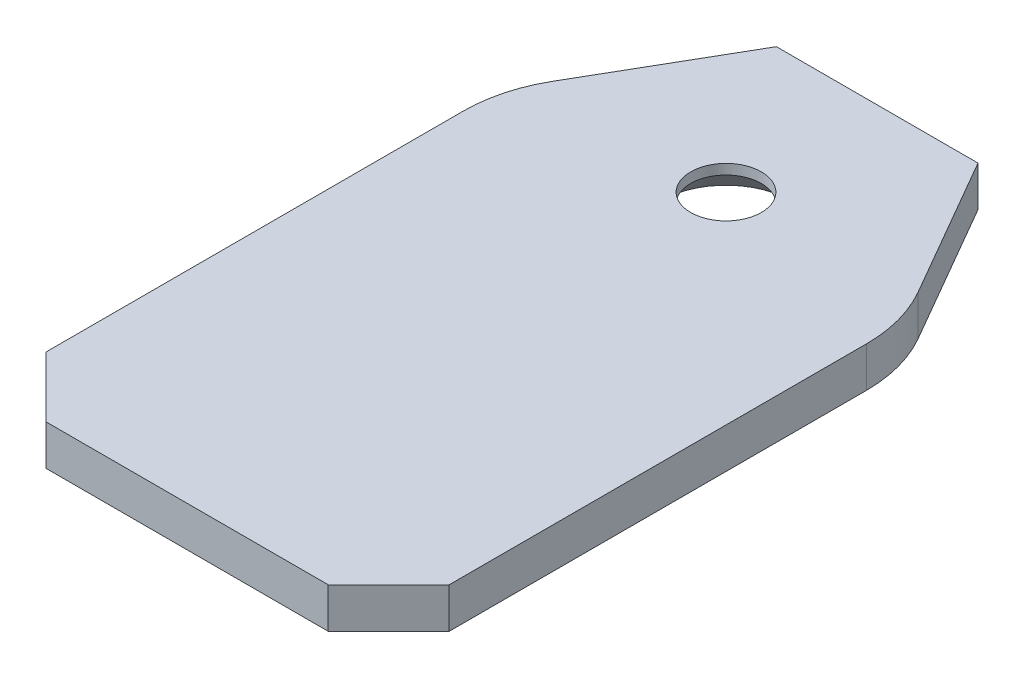
ISO-10303-21;
HEADER;
FILE_DESCRIPTION(('STEP AP214'),'2;1');
FILE_NAME('part.step','',(''),(''),'','','');
FILE_SCHEMA(('AUTOMOTIVE_DESIGN { 1 0 10303 214 1 1 1 1 }'));
ENDSEC;
DATA;
#1=APPLICATION_CONTEXT('core data for automotive mechanical design processes');
#2=APPLICATION_PROTOCOL_DEFINITION('international standard','automotive_design',2000,#1);
#3=PRODUCT_CONTEXT('',#1,'mechanical');
#4=PRODUCT('Part','Part','',(#3));
#5=PRODUCT_RELATED_PRODUCT_CATEGORY('part','',(#4));
#6=PRODUCT_DEFINITION_FORMATION('','',#4);
#7=PRODUCT_DEFINITION_CONTEXT('part definition',#1,'design');
#8=PRODUCT_DEFINITION('design','',#6,#7);
#9=PRODUCT_DEFINITION_SHAPE('','',#8);
#10=(LENGTH_UNIT() NAMED_UNIT(*) SI_UNIT(.MILLI.,.METRE.));
#11=(NAMED_UNIT(*) PLANE_ANGLE_UNIT() SI_UNIT($,.RADIAN.));
#12=(NAMED_UNIT(*) SI_UNIT($,.STERADIAN.) SOLID_ANGLE_UNIT());
#13=UNCERTAINTY_MEASURE_WITH_UNIT(LENGTH_MEASURE(1.E-05),#10,'distance_accuracy_value','');
#14=(GEOMETRIC_REPRESENTATION_CONTEXT(3) GLOBAL_UNCERTAINTY_ASSIGNED_CONTEXT((#13)) GLOBAL_UNIT_ASSIGNED_CONTEXT((#10,
#11,#12)) REPRESENTATION_CONTEXT('',''));
#15=CARTESIAN_POINT('',(0.,0.,0.));
#16=DIRECTION('',(0.,0.,1.));
#17=DIRECTION('',(1.,0.,0.));
#18=AXIS2_PLACEMENT_3D('',#15,#16,#17);
#19=CARTESIAN_POINT('',(-14.1834789470327,-2.,7.17721720077273));
#20=DIRECTION('',(0.,1.,0.));
#21=DIRECTION('',(0.,0.,1.));
#22=AXIS2_PLACEMENT_3D('',#19,#20,#21);
#23=CYLINDRICAL_SURFACE('',#22,7.00000000000001);
#24=CARTESIAN_POINT('',(-14.1834789470327,0.,7.17721720077273));
#25=DIRECTION('',(0.,1.,0.));
#26=DIRECTION('',(0.,0.,1.));
#27=AXIS2_PLACEMENT_3D('',#24,#25,#26);
#28=CIRCLE('',#27,7.00000000000001);
#29=CARTESIAN_POINT('',(-20.2456567735238,0.,3.67721720077272));
#30=VERTEX_POINT('',#29);
#31=CARTESIAN_POINT('',(-21.1834789470327,0.,7.17721720077273));
#32=VERTEX_POINT('',#31);
#33=EDGE_CURVE('E169',#30,#32,#28,.T.);
#34=ORIENTED_EDGE('',*,*,#33,.F.);
#35=DIRECTION('',(0.,1.,0.));
#36=VECTOR('',#35,1.);
#37=CARTESIAN_POINT('',(-20.2456567735238,-2.,3.67721720077272));
#38=LINE('',#37,#36);
#39=CARTESIAN_POINT('',(-20.2456567735238,-2.,3.67721720077272));
#40=VERTEX_POINT('',#39);
#41=EDGE_CURVE('E177',#40,#30,#38,.T.);
#42=ORIENTED_EDGE('',*,*,#41,.F.);
#43=CARTESIAN_POINT('',(-14.1834789470327,-2.,7.17721720077273));
#44=DIRECTION('',(0.,1.,0.));
#45=DIRECTION('',(0.,0.,1.));
#46=AXIS2_PLACEMENT_3D('',#43,#44,#45);
#47=CIRCLE('',#46,7.00000000000001);
#48=CARTESIAN_POINT('',(-21.1834789470327,-2.,7.17721720077273));
#49=VERTEX_POINT('',#48);
#50=EDGE_CURVE('E131',#40,#49,#47,.T.);
#51=ORIENTED_EDGE('',*,*,#50,.T.);
#52=DIRECTION('',(0.,1.,0.));
#53=VECTOR('',#52,1.);
#54=CARTESIAN_POINT('',(-21.1834789470327,-2.,7.17721720077273));
#55=LINE('',#54,#53);
#56=EDGE_CURVE('E173',#49,#32,#55,.T.);
#57=ORIENTED_EDGE('',*,*,#56,.T.);
#58=EDGE_LOOP('',(#34,#42,#51,#57));
#59=FACE_BOUND('',#58,.T.);
#60=ADVANCED_FACE('F36',(#59),#23,.T.);
#61=CARTESIAN_POINT('',(-16.1834789470327,-2.,-3.35868118408953));
#62=DIRECTION('',(-0.866025403784438,0.,-0.500000000000001));
#63=DIRECTION('',(-0.500000000000001,0.,0.866025403784438));
#64=AXIS2_PLACEMENT_3D('',#61,#62,#63);
#65=PLANE('',#64);
#66=DIRECTION('',(-0.500000000000001,0.,0.866025403784438));
#67=VECTOR('',#66,1.);
#68=CARTESIAN_POINT('',(-16.1834789470327,0.,-3.35868118408953));
#69=LINE('',#68,#67);
#70=CARTESIAN_POINT('',(-16.1834789470327,0.,-3.35868118408953));
#71=VERTEX_POINT('',#70);
#72=EDGE_CURVE('E166',#71,#30,#69,.T.);
#73=ORIENTED_EDGE('',*,*,#72,.F.);
#74=DIRECTION('',(0.,1.,0.));
#75=VECTOR('',#74,1.);
#76=CARTESIAN_POINT('',(-16.1834789470327,-2.,-3.35868118408953));
#77=LINE('',#76,#75);
#78=CARTESIAN_POINT('',(-16.1834789470327,-2.,-3.35868118408953));
#79=VERTEX_POINT('',#78);
#80=EDGE_CURVE('E179',#79,#71,#77,.T.);
#81=ORIENTED_EDGE('',*,*,#80,.F.);
#82=DIRECTION('',(-0.500000000000001,0.,0.866025403784438));
#83=VECTOR('',#82,1.);
#84=CARTESIAN_POINT('',(-16.1834789470327,-2.,-3.35868118408953));
#85=LINE('',#84,#83);
#86=EDGE_CURVE('E145',#79,#40,#85,.T.);
#87=ORIENTED_EDGE('',*,*,#86,.T.);
#88=ORIENTED_EDGE('',*,*,#41,.T.);
#89=EDGE_LOOP('',(#73,#81,#87,#88));
#90=FACE_BOUND('',#89,.T.);
#91=ADVANCED_FACE('F216',(#90),#65,.T.);
#92=CARTESIAN_POINT('',(-6.1834789470327,-2.,-3.35868118408953));
#93=DIRECTION('',(0.,0.,-1.));
#94=DIRECTION('',(-1.,0.,0.));
#95=AXIS2_PLACEMENT_3D('',#92,#93,#94);
#96=PLANE('',#95);
#97=DIRECTION('',(-1.,0.,0.));
#98=VECTOR('',#97,1.);
#99=CARTESIAN_POINT('',(-6.1834789470327,0.,-3.35868118408953));
#100=LINE('',#99,#98);
#101=CARTESIAN_POINT('',(-6.1834789470327,0.,-3.35868118408953));
#102=VERTEX_POINT('',#101);
#103=EDGE_CURVE('E163',#102,#71,#100,.T.);
#104=ORIENTED_EDGE('',*,*,#103,.F.);
#105=DIRECTION('',(0.,1.,0.));
#106=VECTOR('',#105,1.);
#107=CARTESIAN_POINT('',(-6.1834789470327,-2.,-3.35868118408953));
#108=LINE('',#107,#106);
#109=CARTESIAN_POINT('',(-6.1834789470327,-2.,-3.35868118408953));
#110=VERTEX_POINT('',#109);
#111=EDGE_CURVE('E181',#110,#102,#108,.T.);
#112=ORIENTED_EDGE('',*,*,#111,.F.);
#113=DIRECTION('',(-1.,0.,0.));
#114=VECTOR('',#113,1.);
#115=CARTESIAN_POINT('',(-6.1834789470327,-2.,-3.35868118408953));
#116=LINE('',#115,#114);
#117=EDGE_CURVE('E139',#110,#79,#116,.T.);
#118=ORIENTED_EDGE('',*,*,#117,.T.);
#119=ORIENTED_EDGE('',*,*,#80,.T.);
#120=EDGE_LOOP('',(#104,#112,#118,#119));
#121=FACE_BOUND('',#120,.T.);
#122=ADVANCED_FACE('F222',(#121),#96,.T.);
#123=CARTESIAN_POINT('',(-2.12130112054162,-2.,3.67721720077271));
#124=DIRECTION('',(0.866025403784438,0.,-0.500000000000001));
#125=DIRECTION('',(-0.500000000000001,0.,-0.866025403784438));
#126=AXIS2_PLACEMENT_3D('',#123,#124,#125);
#127=PLANE('',#126);
#128=DIRECTION('',(-0.500000000000001,0.,-0.866025403784438));
#129=VECTOR('',#128,1.);
#130=CARTESIAN_POINT('',(-2.12130112054162,0.,3.67721720077271));
#131=LINE('',#130,#129);
#132=CARTESIAN_POINT('',(-2.12130112054162,0.,3.67721720077271));
#133=VERTEX_POINT('',#132);
#134=EDGE_CURVE('E160',#133,#102,#131,.T.);
#135=ORIENTED_EDGE('',*,*,#134,.F.);
#136=DIRECTION('',(0.,1.,0.));
#137=VECTOR('',#136,1.);
#138=CARTESIAN_POINT('',(-2.12130112054162,-2.,3.67721720077271));
#139=LINE('',#138,#137);
#140=CARTESIAN_POINT('',(-2.12130112054162,-2.,3.67721720077271));
#141=VERTEX_POINT('',#140);
#142=EDGE_CURVE('E130',#141,#133,#139,.T.);
#143=ORIENTED_EDGE('',*,*,#142,.F.);
#144=DIRECTION('',(-0.500000000000001,0.,-0.866025403784438));
#145=VECTOR('',#144,1.);
#146=CARTESIAN_POINT('',(-2.12130112054162,-2.,3.67721720077271));
#147=LINE('',#146,#145);
#148=EDGE_CURVE('E137',#141,#110,#147,.T.);
#149=ORIENTED_EDGE('',*,*,#148,.T.);
#150=ORIENTED_EDGE('',*,*,#111,.T.);
#151=EDGE_LOOP('',(#135,#143,#149,#150));
#152=FACE_BOUND('',#151,.T.);
#153=ADVANCED_FACE('F232',(#152),#127,.T.);
#154=CARTESIAN_POINT('',(-8.18347894703268,-2.,7.17721720077272));
#155=DIRECTION('',(0.,1.,0.));
#156=DIRECTION('',(0.,0.,1.));
#157=AXIS2_PLACEMENT_3D('',#154,#155,#156);
#158=CYLINDRICAL_SURFACE('',#157,7.);
#159=CARTESIAN_POINT('',(-8.18347894703268,0.,7.17721720077272));
#160=DIRECTION('',(0.,1.,0.));
#161=DIRECTION('',(0.,0.,1.));
#162=AXIS2_PLACEMENT_3D('',#159,#160,#161);
#163=CIRCLE('',#162,7.);
#164=CARTESIAN_POINT('',(-1.18347894703268,0.,7.17721720077272));
#165=VERTEX_POINT('',#164);
#166=EDGE_CURVE('E129',#165,#133,#163,.T.);
#167=ORIENTED_EDGE('',*,*,#166,.F.);
#168=DIRECTION('',(0.,1.,0.));
#169=VECTOR('',#168,1.);
#170=CARTESIAN_POINT('',(-1.18347894703268,-2.,7.17721720077272));
#171=LINE('',#170,#169);
#172=CARTESIAN_POINT('',(-1.18347894703268,-2.,7.17721720077272));
#173=VERTEX_POINT('',#172);
#174=EDGE_CURVE('E118',#173,#165,#171,.T.);
#175=ORIENTED_EDGE('',*,*,#174,.F.);
#176=CARTESIAN_POINT('',(-8.18347894703268,-2.,7.17721720077272));
#177=DIRECTION('',(0.,1.,0.));
#178=DIRECTION('',(0.,0.,1.));
#179=AXIS2_PLACEMENT_3D('',#176,#177,#178);
#180=CIRCLE('',#179,7.);
#181=EDGE_CURVE('E122',#173,#141,#180,.T.);
#182=ORIENTED_EDGE('',*,*,#181,.T.);
#183=ORIENTED_EDGE('',*,*,#142,.T.);
#184=EDGE_LOOP('',(#167,#175,#182,#183));
#185=FACE_BOUND('',#184,.T.);
#186=ADVANCED_FACE('F127',(#185),#158,.T.);
#187=CARTESIAN_POINT('',(-1.18347894703268,-2.,7.64131881591047));
#188=DIRECTION('',(1.,0.,0.));
#189=DIRECTION('',(0.,0.,-1.));
#190=AXIS2_PLACEMENT_3D('',#187,#188,#189);
#191=PLANE('',#190);
#192=DIRECTION('',(0.,0.,-1.));
#193=VECTOR('',#192,1.);
#194=CARTESIAN_POINT('',(-1.18347894703268,0.,7.64131881591047));
#195=LINE('',#194,#193);
#196=CARTESIAN_POINT('',(-1.18347894703261,0.,27.8736136443397));
#197=VERTEX_POINT('',#196);
#198=EDGE_CURVE('E157',#197,#165,#195,.T.);
#199=ORIENTED_EDGE('',*,*,#198,.F.);
#200=DIRECTION('',(0.,-1.,0.));
#201=VECTOR('',#200,1.);
#202=CARTESIAN_POINT('',(-1.18347894703261,-2.,27.8736136443397));
#203=LINE('',#202,#201);
#204=CARTESIAN_POINT('',(-1.18347894703268,-2.,27.8736136443397));
#205=VERTEX_POINT('',#204);
#206=EDGE_CURVE('E60',#197,#205,#203,.T.);
#207=ORIENTED_EDGE('',*,*,#206,.T.);
#208=DIRECTION('',(0.,0.,-1.));
#209=VECTOR('',#208,1.);
#210=CARTESIAN_POINT('',(-1.18347894703268,-2.,7.64131881591047));
#211=LINE('',#210,#209);
#212=EDGE_CURVE('E115',#205,#173,#211,.T.);
#213=ORIENTED_EDGE('',*,*,#212,.T.);
#214=ORIENTED_EDGE('',*,*,#174,.T.);
#215=EDGE_LOOP('',(#199,#207,#213,#214));
#216=FACE_BOUND('',#215,.T.);
#217=ADVANCED_FACE('F117',(#216),#191,.T.);
#218=CARTESIAN_POINT('',(-1.18347894703268,-2.,30.8736136443398));
#219=DIRECTION('',(0.,0.,1.));
#220=DIRECTION('',(1.,0.,0.));
#221=AXIS2_PLACEMENT_3D('',#218,#219,#220);
#222=PLANE('',#221);
#223=DIRECTION('',(1.,0.,0.));
#224=VECTOR('',#223,1.);
#225=CARTESIAN_POINT('',(-1.18347894703268,-2.,30.8736136443398));
#226=LINE('',#225,#224);
#227=CARTESIAN_POINT('',(-18.1834789470327,-2.,30.8736136443398));
#228=VERTEX_POINT('',#227);
#229=CARTESIAN_POINT('',(-4.18347894703267,-2.,30.8736136443398));
#230=VERTEX_POINT('',#229);
#231=EDGE_CURVE('E123',#228,#230,#226,.T.);
#232=ORIENTED_EDGE('',*,*,#231,.T.);
#233=DIRECTION('',(0.,1.,0.));
#234=VECTOR('',#233,1.);
#235=CARTESIAN_POINT('',(-4.18347894703267,-2.,30.8736136443398));
#236=LINE('',#235,#234);
#237=CARTESIAN_POINT('',(-4.18347894703267,0.,30.8736136443398));
#238=VERTEX_POINT('',#237);
#239=EDGE_CURVE('E187',#230,#238,#236,.T.);
#240=ORIENTED_EDGE('',*,*,#239,.T.);
#241=DIRECTION('',(1.,0.,0.));
#242=VECTOR('',#241,1.);
#243=CARTESIAN_POINT('',(-1.18347894703268,0.,30.8736136443398));
#244=LINE('',#243,#242);
#245=CARTESIAN_POINT('',(-18.1834789470327,0.,30.8736136443398));
#246=VERTEX_POINT('',#245);
#247=EDGE_CURVE('E153',#246,#238,#244,.T.);
#248=ORIENTED_EDGE('',*,*,#247,.F.);
#249=DIRECTION('',(0.,-1.,0.));
#250=VECTOR('',#249,1.);
#251=CARTESIAN_POINT('',(-18.1834789470327,-2.,30.8736136443398));
#252=LINE('',#251,#250);
#253=EDGE_CURVE('E176',#246,#228,#252,.T.);
#254=ORIENTED_EDGE('',*,*,#253,.T.);
#255=EDGE_LOOP('',(#232,#240,#248,#254));
#256=FACE_BOUND('',#255,.T.);
#257=ADVANCED_FACE('F241',(#256),#222,.T.);
#258=CARTESIAN_POINT('',(-21.1834789470327,-2.,7.64131881591047));
#259=DIRECTION('',(-1.,0.,0.));
#260=DIRECTION('',(0.,0.,1.));
#261=AXIS2_PLACEMENT_3D('',#258,#259,#260);
#262=PLANE('',#261);
#263=DIRECTION('',(0.,0.,1.));
#264=VECTOR('',#263,1.);
#265=CARTESIAN_POINT('',(-21.1834789470327,-2.,7.17721720077273));
#266=LINE('',#265,#264);
#267=CARTESIAN_POINT('',(-21.1834789470327,-2.,27.8736136443398));
#268=VERTEX_POINT('',#267);
#269=EDGE_CURVE('E172',#49,#268,#266,.T.);
#270=ORIENTED_EDGE('',*,*,#269,.T.);
#271=DIRECTION('',(0.,1.,0.));
#272=VECTOR('',#271,1.);
#273=CARTESIAN_POINT('',(-21.1834789470327,-2.,27.8736136443398));
#274=LINE('',#273,#272);
#275=CARTESIAN_POINT('',(-21.1834789470327,0.,27.8736136443398));
#276=VERTEX_POINT('',#275);
#277=EDGE_CURVE('E198',#268,#276,#274,.T.);
#278=ORIENTED_EDGE('',*,*,#277,.T.);
#279=DIRECTION('',(0.,0.,1.));
#280=VECTOR('',#279,1.);
#281=CARTESIAN_POINT('',(-21.1834789470327,0.,7.64131881591047));
#282=LINE('',#281,#280);
#283=EDGE_CURVE('E150',#32,#276,#282,.T.);
#284=ORIENTED_EDGE('',*,*,#283,.F.);
#285=ORIENTED_EDGE('',*,*,#56,.F.);
#286=EDGE_LOOP('',(#270,#278,#284,#285));
#287=FACE_BOUND('',#286,.T.);
#288=ADVANCED_FACE('F244',(#287),#262,.T.);
#289=CARTESIAN_POINT('',(-8.18347894703268,-2.,7.17721720077272));
#290=DIRECTION('',(0.,1.,0.));
#291=DIRECTION('',(0.,0.,1.));
#292=AXIS2_PLACEMENT_3D('',#289,#290,#291);
#293=PLANE('',#292);
#294=CARTESIAN_POINT('',(-11.1834789470327,-2.,4.14131881591047));
#295=DIRECTION('',(0.,1.,0.));
#296=DIRECTION('',(0.,0.,1.));
#297=AXIS2_PLACEMENT_3D('',#294,#295,#296);
#298=CIRCLE('',#297,3.25);
#299=CARTESIAN_POINT('',(-11.1834789470327,-2.,0.891318815910468));
#300=VERTEX_POINT('',#299);
#301=EDGE_CURVE('E11',#300,#300,#298,.T.);
#302=ORIENTED_EDGE('',*,*,#301,.T.);
#303=EDGE_LOOP('',(#302));
#304=FACE_BOUND('',#303,.T.);
#305=ORIENTED_EDGE('',*,*,#212,.F.);
#306=DIRECTION('',(0.707106781186543,0.,-0.707106781186552));
#307=VECTOR('',#306,1.);
#308=CARTESIAN_POINT('',(-4.18347894703267,-2.,30.8736136443398));
#309=LINE('',#308,#307);
#310=EDGE_CURVE('E196',#205,#230,#309,.F.);
#311=ORIENTED_EDGE('',*,*,#310,.T.);
#312=ORIENTED_EDGE('',*,*,#231,.F.);
#313=DIRECTION('',(0.707106781186549,0.,0.707106781186546));
#314=VECTOR('',#313,1.);
#315=CARTESIAN_POINT('',(-21.1834789470327,-2.,27.8736136443398));
#316=LINE('',#315,#314);
#317=EDGE_CURVE('E52',#228,#268,#316,.F.);
#318=ORIENTED_EDGE('',*,*,#317,.T.);
#319=ORIENTED_EDGE('',*,*,#269,.F.);
#320=ORIENTED_EDGE('',*,*,#50,.F.);
#321=ORIENTED_EDGE('',*,*,#86,.F.);
#322=ORIENTED_EDGE('',*,*,#117,.F.);
#323=ORIENTED_EDGE('',*,*,#148,.F.);
#324=ORIENTED_EDGE('',*,*,#181,.F.);
#325=EDGE_LOOP('',(#305,#311,#312,#318,#319,#320,#321,#322,#323,#324));
#326=FACE_BOUND('',#325,.T.);
#327=ADVANCED_FACE('F134',(#304,#326),#293,.F.);
#328=CARTESIAN_POINT('',(-8.18347894703268,0.,7.17721720077272));
#329=DIRECTION('',(0.,1.,0.));
#330=DIRECTION('',(0.,0.,1.));
#331=AXIS2_PLACEMENT_3D('',#328,#329,#330);
#332=PLANE('',#331);
#333=CARTESIAN_POINT('',(-11.1834789470327,0.,4.14131881591047));
#334=DIRECTION('',(0.,1.,0.));
#335=DIRECTION('',(0.,0.,1.));
#336=AXIS2_PLACEMENT_3D('',#333,#334,#335);
#337=CIRCLE('',#336,1.75);
#338=CARTESIAN_POINT('',(-11.1834789470327,0.,5.89131881591047));
#339=VERTEX_POINT('',#338);
#340=EDGE_CURVE('E154',#339,#339,#337,.T.);
#341=ORIENTED_EDGE('',*,*,#340,.F.);
#342=EDGE_LOOP('',(#341));
#343=FACE_BOUND('',#342,.T.);
#344=ORIENTED_EDGE('',*,*,#247,.T.);
#345=DIRECTION('',(-0.707106781186543,0.,0.707106781186552));
#346=VECTOR('',#345,1.);
#347=CARTESIAN_POINT('',(5.66471927475087,0.,21.0254154225561));
#348=LINE('',#347,#346);
#349=EDGE_CURVE('E192',#238,#197,#348,.F.);
#350=ORIENTED_EDGE('',*,*,#349,.T.);
#351=ORIENTED_EDGE('',*,*,#198,.T.);
#352=ORIENTED_EDGE('',*,*,#166,.T.);
#353=ORIENTED_EDGE('',*,*,#134,.T.);
#354=ORIENTED_EDGE('',*,*,#103,.T.);
#355=ORIENTED_EDGE('',*,*,#72,.T.);
#356=ORIENTED_EDGE('',*,*,#33,.T.);
#357=ORIENTED_EDGE('',*,*,#283,.T.);
#358=DIRECTION('',(-0.707106781186549,0.,-0.707106781186546));
#359=VECTOR('',#358,1.);
#360=CARTESIAN_POINT('',(-25.0316771688162,0.,24.0254154225563));
#361=LINE('',#360,#359);
#362=EDGE_CURVE('E190',#276,#246,#361,.F.);
#363=ORIENTED_EDGE('',*,*,#362,.T.);
#364=EDGE_LOOP('',(#344,#350,#351,#352,#353,#354,#355,#356,#357,#363));
#365=FACE_BOUND('',#364,.T.);
#366=ADVANCED_FACE('F227',(#343,#365),#332,.T.);
#367=CARTESIAN_POINT('',(-11.1834789470327,8.,4.14131881591047));
#368=DIRECTION('',(0.,-1.,0.));
#369=DIRECTION('',(0.,0.,-1.));
#370=AXIS2_PLACEMENT_3D('',#367,#368,#369);
#371=CYLINDRICAL_SURFACE('',#370,1.75);
#372=CARTESIAN_POINT('',(-11.1834789470327,-0.499999999999997,4.14131881591047));
#373=DIRECTION('',(0.,1.,0.));
#374=DIRECTION('',(0.,0.,1.));
#375=AXIS2_PLACEMENT_3D('',#372,#373,#374);
#376=CIRCLE('',#375,1.75);
#377=CARTESIAN_POINT('',(-11.1834789470327,-0.499999999999997,2.39131881591047));
#378=VERTEX_POINT('',#377);
#379=EDGE_CURVE('E45',#378,#378,#376,.F.);
#380=ORIENTED_EDGE('',*,*,#379,.T.);
#381=EDGE_LOOP('',(#380));
#382=FACE_BOUND('',#381,.T.);
#383=ORIENTED_EDGE('',*,*,#340,.T.);
#384=EDGE_LOOP('',(#383));
#385=FACE_BOUND('',#384,.T.);
#386=ADVANCED_FACE('F203',(#382,#385),#371,.F.);
#387=CARTESIAN_POINT('',(-4.18347894703267,-2.,30.8736136443398));
#388=DIRECTION('',(-0.707106781186552,0.,-0.707106781186543));
#389=DIRECTION('',(0.,1.,0.));
#390=AXIS2_PLACEMENT_3D('',#387,#388,#389);
#391=PLANE('',#390);
#392=ORIENTED_EDGE('',*,*,#310,.F.);
#393=ORIENTED_EDGE('',*,*,#206,.F.);
#394=ORIENTED_EDGE('',*,*,#349,.F.);
#395=ORIENTED_EDGE('',*,*,#239,.F.);
#396=EDGE_LOOP('',(#392,#393,#394,#395));
#397=FACE_BOUND('',#396,.T.);
#398=ADVANCED_FACE('F212',(#397),#391,.F.);
#399=CARTESIAN_POINT('',(-21.1834789470327,-2.,27.8736136443398));
#400=DIRECTION('',(0.707106781186546,0.,-0.707106781186549));
#401=DIRECTION('',(0.,1.,0.));
#402=AXIS2_PLACEMENT_3D('',#399,#400,#401);
#403=PLANE('',#402);
#404=ORIENTED_EDGE('',*,*,#317,.F.);
#405=ORIENTED_EDGE('',*,*,#253,.F.);
#406=ORIENTED_EDGE('',*,*,#362,.F.);
#407=ORIENTED_EDGE('',*,*,#277,.F.);
#408=EDGE_LOOP('',(#404,#405,#406,#407));
#409=FACE_BOUND('',#408,.T.);
#410=ADVANCED_FACE('F207',(#409),#403,.F.);
#411=CARTESIAN_POINT('',(-11.1834789470327,-0.499999999999997,4.14131881591047));
#412=DIRECTION('',(0.,-1.,0.));
#413=DIRECTION('',(0.,0.,-1.));
#414=AXIS2_PLACEMENT_3D('',#411,#412,#413);
#415=CONICAL_SURFACE('',#414,1.75,0.785398163397448);
#416=CARTESIAN_POINT('',(-11.1834789470327,-2.,0.891318815910468));
#417=CARTESIAN_POINT('',(-11.1834789470327,-1.984375,0.906943815910468));
#418=CARTESIAN_POINT('',(-11.1834789470327,-1.96875,0.922568815910468));
#419=CARTESIAN_POINT('',(-11.1834789470327,-1.9375,0.953818815910469));
#420=CARTESIAN_POINT('',(-11.1834789470327,-1.921875,0.969443815910469));
#421=CARTESIAN_POINT('',(-11.1834789470327,-1.890625,1.00069381591047));
#422=CARTESIAN_POINT('',(-11.1834789470327,-1.875,1.01631881591047));
#423=CARTESIAN_POINT('',(-11.1834789470327,-1.84375,1.04756881591047));
#424=CARTESIAN_POINT('',(-11.1834789470327,-1.828125,1.06319381591047));
#425=CARTESIAN_POINT('',(-11.1834789470327,-1.796875,1.09444381591047));
#426=CARTESIAN_POINT('',(-11.1834789470327,-1.78125,1.11006881591047));
#427=CARTESIAN_POINT('',(-11.1834789470327,-1.75,1.14131881591047));
#428=CARTESIAN_POINT('',(-11.1834789470327,-1.734375,1.15694381591047));
#429=CARTESIAN_POINT('',(-11.1834789470327,-1.703125,1.18819381591047));
#430=CARTESIAN_POINT('',(-11.1834789470327,-1.6875,1.20381881591047));
#431=CARTESIAN_POINT('',(-11.1834789470327,-1.65625,1.23506881591047));
#432=CARTESIAN_POINT('',(-11.1834789470327,-1.640625,1.25069381591047));
#433=CARTESIAN_POINT('',(-11.1834789470327,-1.609375,1.28194381591047));
#434=CARTESIAN_POINT('',(-11.1834789470327,-1.59375,1.29756881591047));
#435=CARTESIAN_POINT('',(-11.1834789470327,-1.5625,1.32881881591047));
#436=CARTESIAN_POINT('',(-11.1834789470327,-1.546875,1.34444381591047));
#437=CARTESIAN_POINT('',(-11.1834789470327,-1.515625,1.37569381591047));
#438=CARTESIAN_POINT('',(-11.1834789470327,-1.5,1.39131881591047));
#439=CARTESIAN_POINT('',(-11.1834789470327,-1.46875,1.42256881591047));
#440=CARTESIAN_POINT('',(-11.1834789470327,-1.453125,1.43819381591047));
#441=CARTESIAN_POINT('',(-11.1834789470327,-1.421875,1.46944381591047));
#442=CARTESIAN_POINT('',(-11.1834789470327,-1.40625,1.48506881591047));
#443=CARTESIAN_POINT('',(-11.1834789470327,-1.375,1.51631881591047));
#444=CARTESIAN_POINT('',(-11.1834789470327,-1.359375,1.53194381591047));
#445=CARTESIAN_POINT('',(-11.1834789470327,-1.328125,1.56319381591047));
#446=CARTESIAN_POINT('',(-11.1834789470327,-1.3125,1.57881881591047));
#447=CARTESIAN_POINT('',(-11.1834789470327,-1.28125,1.61006881591047));
#448=CARTESIAN_POINT('',(-11.1834789470327,-1.265625,1.62569381591047));
#449=CARTESIAN_POINT('',(-11.1834789470327,-1.234375,1.65694381591047));
#450=CARTESIAN_POINT('',(-11.1834789470327,-1.21875,1.67256881591047));
#451=CARTESIAN_POINT('',(-11.1834789470327,-1.1875,1.70381881591047));
#452=CARTESIAN_POINT('',(-11.1834789470327,-1.171875,1.71944381591047));
#453=CARTESIAN_POINT('',(-11.1834789470327,-1.140625,1.75069381591047));
#454=CARTESIAN_POINT('',(-11.1834789470327,-1.125,1.76631881591047));
#455=CARTESIAN_POINT('',(-11.1834789470327,-1.09375,1.79756881591047));
#456=CARTESIAN_POINT('',(-11.1834789470327,-1.078125,1.81319381591047));
#457=CARTESIAN_POINT('',(-11.1834789470327,-1.046875,1.84444381591047));
#458=CARTESIAN_POINT('',(-11.1834789470327,-1.03125,1.86006881591047));
#459=CARTESIAN_POINT('',(-11.1834789470327,-0.999999999999998,1.89131881591047));
#460=CARTESIAN_POINT('',(-11.1834789470327,-0.984374999999998,1.90694381591047));
#461=CARTESIAN_POINT('',(-11.1834789470327,-0.953124999999998,1.93819381591047));
#462=CARTESIAN_POINT('',(-11.1834789470327,-0.937499999999998,1.95381881591047));
#463=CARTESIAN_POINT('',(-11.1834789470327,-0.906249999999998,1.98506881591047));
#464=CARTESIAN_POINT('',(-11.1834789470327,-0.890624999999998,2.00069381591047));
#465=CARTESIAN_POINT('',(-11.1834789470327,-0.859374999999998,2.03194381591047));
#466=CARTESIAN_POINT('',(-11.1834789470327,-0.843749999999998,2.04756881591047));
#467=CARTESIAN_POINT('',(-11.1834789470327,-0.812499999999998,2.07881881591047));
#468=CARTESIAN_POINT('',(-11.1834789470327,-0.796874999999998,2.09444381591047));
#469=CARTESIAN_POINT('',(-11.1834789470327,-0.765624999999998,2.12569381591047));
#470=CARTESIAN_POINT('',(-11.1834789470327,-0.749999999999998,2.14131881591047));
#471=CARTESIAN_POINT('',(-11.1834789470327,-0.718749999999997,2.17256881591047));
#472=CARTESIAN_POINT('',(-11.1834789470327,-0.703124999999997,2.18819381591047));
#473=CARTESIAN_POINT('',(-11.1834789470327,-0.671874999999997,2.21944381591047));
#474=CARTESIAN_POINT('',(-11.1834789470327,-0.656249999999997,2.23506881591047));
#475=CARTESIAN_POINT('',(-11.1834789470327,-0.624999999999997,2.26631881591047));
#476=CARTESIAN_POINT('',(-11.1834789470327,-0.609374999999997,2.28194381591047));
#477=CARTESIAN_POINT('',(-11.1834789470327,-0.578124999999997,2.31319381591047));
#478=CARTESIAN_POINT('',(-11.1834789470327,-0.562499999999997,2.32881881591047));
#479=CARTESIAN_POINT('',(-11.1834789470327,-0.531249999999997,2.36006881591047));
#480=CARTESIAN_POINT('',(-11.1834789470327,-0.515624999999997,2.37569381591047));
#481=CARTESIAN_POINT('',(-11.1834789470327,-0.499999999999997,2.39131881591047));
#482=B_SPLINE_CURVE_WITH_KNOTS('',3,(#416,#417,#418,#419,#420,#421,#422,#423,#424,#425,#426,
#427,#428,#429,#430,#431,#432,#433,#434,#435,#436,#437,#438,#439,#440,#441,#442,#443,#444,#445,
#446,#447,#448,#449,#450,#451,#452,#453,#454,#455,#456,#457,#458,#459,#460,#461,#462,#463,#464,
#465,#466,#467,#468,#469,#470,#471,#472,#473,#474,#475,#476,#477,#478,#479,#480,#481),
.UNSPECIFIED.,.F.,.F.,(4,2,2,2,2,2,2,2,2,2,2,2,2,2,2,2,2,2,2,2,2,2,2,2,2,2,2,2,2,2,2,2,4),(0.,
0.0662912607362389,0.132582521472478,0.198873782208717,0.265165042944956,0.331456303681195,
0.397747564417434,0.464038825153673,0.530330085889912,0.596621346626151,0.66291260736239,
0.729203868098629,0.795495128834868,0.861786389571107,0.928077650307346,0.994368911043585,
1.06066017177982,1.12695143251606,1.1932426932523,1.25953395398854,1.32582521472478,
1.39211647546102,1.45840773619726,1.5246989969335,1.59099025766974,1.65728151840597,
1.72357277914221,1.78986403987845,1.85615530061469,1.92244656135093,1.98873782208717,
2.05502908282341,2.12132034355965),.UNSPECIFIED.);
#483=EDGE_CURVE('BSEAM39',#300,#378,#482,.T.);
#484=ORIENTED_EDGE('',*,*,#301,.F.);
#485=ORIENTED_EDGE('',*,*,#379,.F.);
#486=ORIENTED_EDGE('',*,*,#483,.T.);
#487=ORIENTED_EDGE('',*,*,#483,.F.);
#488=EDGE_LOOP('',(#484,#486,#485,#487));
#489=FACE_BOUND('',#488,.T.);
#490=ADVANCED_FACE('F39',(#489),#415,.F.);
#491=CLOSED_SHELL('',(#60,#91,#122,#153,#186,#217,#257,#288,#327,#366,#386,#398,#410,#490));
#492=MANIFOLD_SOLID_BREP('B2',#491);
#493=ADVANCED_BREP_SHAPE_REPRESENTATION('',(#18,#492),#14);
#494=SHAPE_DEFINITION_REPRESENTATION(#9,#493);
ENDSEC;
END-ISO-10303-21;
